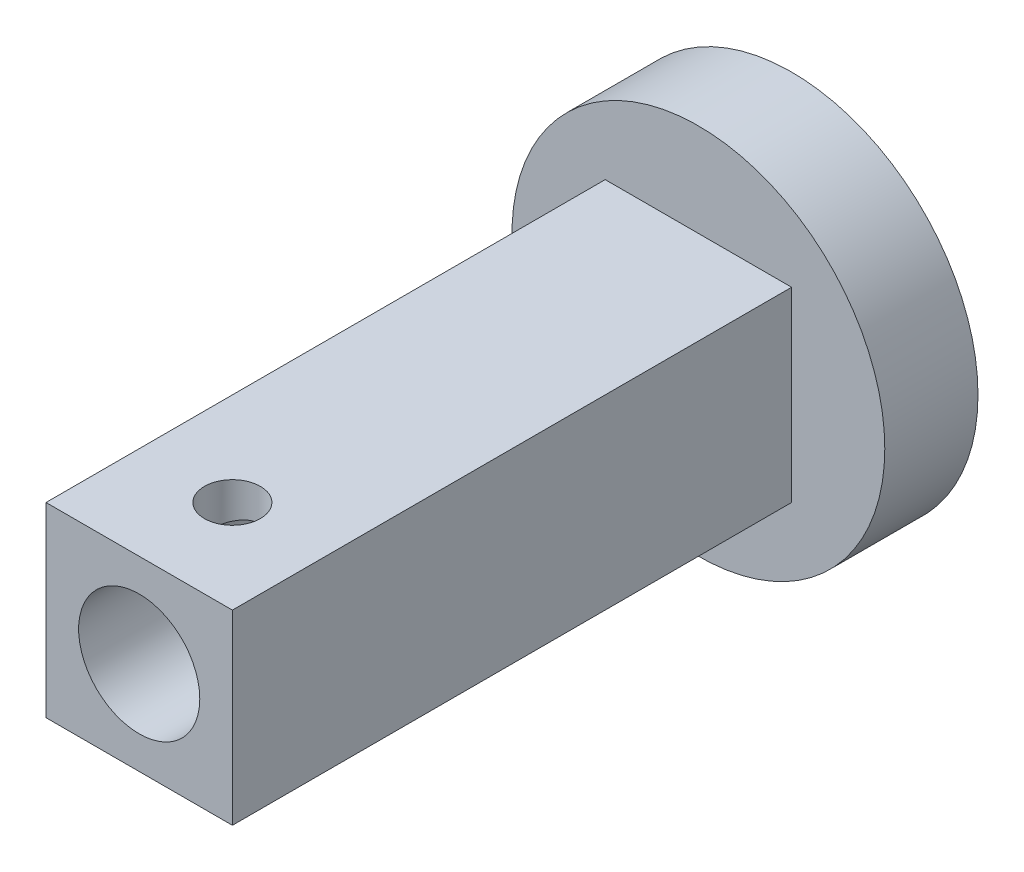
ISO-10303-21;
HEADER;
FILE_DESCRIPTION(('STEP AP214'),'2;1');
FILE_NAME('part.step','',(''),(''),'','','');
FILE_SCHEMA(('AUTOMOTIVE_DESIGN { 1 0 10303 214 1 1 1 1 }'));
ENDSEC;
DATA;
#1=APPLICATION_CONTEXT('core data for automotive mechanical design processes');
#2=APPLICATION_PROTOCOL_DEFINITION('international standard','automotive_design',2000,#1);
#3=PRODUCT_CONTEXT('',#1,'mechanical');
#4=PRODUCT('Part','Part','',(#3));
#5=PRODUCT_RELATED_PRODUCT_CATEGORY('part','',(#4));
#6=PRODUCT_DEFINITION_FORMATION('','',#4);
#7=PRODUCT_DEFINITION_CONTEXT('part definition',#1,'design');
#8=PRODUCT_DEFINITION('design','',#6,#7);
#9=PRODUCT_DEFINITION_SHAPE('','',#8);
#10=(LENGTH_UNIT() NAMED_UNIT(*) SI_UNIT(.MILLI.,.METRE.));
#11=(NAMED_UNIT(*) PLANE_ANGLE_UNIT() SI_UNIT($,.RADIAN.));
#12=(NAMED_UNIT(*) SI_UNIT($,.STERADIAN.) SOLID_ANGLE_UNIT());
#13=UNCERTAINTY_MEASURE_WITH_UNIT(LENGTH_MEASURE(1.E-05),#10,'distance_accuracy_value','');
#14=(GEOMETRIC_REPRESENTATION_CONTEXT(3) GLOBAL_UNCERTAINTY_ASSIGNED_CONTEXT((#13)) GLOBAL_UNIT_ASSIGNED_CONTEXT((#10,
#11,#12)) REPRESENTATION_CONTEXT('',''));
#15=CARTESIAN_POINT('',(0.,0.,0.));
#16=DIRECTION('',(0.,0.,1.));
#17=DIRECTION('',(1.,0.,0.));
#18=AXIS2_PLACEMENT_3D('',#15,#16,#17);
#19=CARTESIAN_POINT('',(0.,0.,5.));
#20=DIRECTION('',(0.,0.,1.));
#21=DIRECTION('',(1.,0.,0.));
#22=AXIS2_PLACEMENT_3D('',#19,#20,#21);
#23=PLANE('',#22);
#24=CARTESIAN_POINT('',(0.,0.,5.));
#25=DIRECTION('',(0.,0.,1.));
#26=DIRECTION('',(1.,0.,0.));
#27=AXIS2_PLACEMENT_3D('',#24,#25,#26);
#28=CIRCLE('',#27,10.);
#29=CARTESIAN_POINT('',(10.,0.,5.));
#30=VERTEX_POINT('',#29);
#31=EDGE_CURVE('E11',#30,#30,#28,.T.);
#32=ORIENTED_EDGE('',*,*,#31,.T.);
#33=EDGE_LOOP('',(#32));
#34=FACE_BOUND('',#33,.T.);
#35=DIRECTION('',(-1.,0.,0.));
#36=VECTOR('',#35,1.);
#37=CARTESIAN_POINT('',(-5.,5.,5.));
#38=LINE('',#37,#36);
#39=CARTESIAN_POINT('',(5.,5.,5.));
#40=VERTEX_POINT('',#39);
#41=CARTESIAN_POINT('',(-5.,5.,5.));
#42=VERTEX_POINT('',#41);
#43=EDGE_CURVE('E92',#40,#42,#38,.T.);
#44=ORIENTED_EDGE('',*,*,#43,.F.);
#45=DIRECTION('',(0.,1.,0.));
#46=VECTOR('',#45,1.);
#47=CARTESIAN_POINT('',(5.,-5.,5.));
#48=LINE('',#47,#46);
#49=CARTESIAN_POINT('',(5.,-5.,5.));
#50=VERTEX_POINT('',#49);
#51=EDGE_CURVE('E103',#50,#40,#48,.T.);
#52=ORIENTED_EDGE('',*,*,#51,.F.);
#53=DIRECTION('',(1.,0.,0.));
#54=VECTOR('',#53,1.);
#55=CARTESIAN_POINT('',(-5.,-5.,5.));
#56=LINE('',#55,#54);
#57=CARTESIAN_POINT('',(-5.,-5.,5.));
#58=VERTEX_POINT('',#57);
#59=EDGE_CURVE('E73',#58,#50,#56,.T.);
#60=ORIENTED_EDGE('',*,*,#59,.F.);
#61=DIRECTION('',(0.,-1.,0.));
#62=VECTOR('',#61,1.);
#63=CARTESIAN_POINT('',(-5.,-5.,5.));
#64=LINE('',#63,#62);
#65=EDGE_CURVE('E108',#42,#58,#64,.T.);
#66=ORIENTED_EDGE('',*,*,#65,.F.);
#67=EDGE_LOOP('',(#44,#52,#60,#66));
#68=FACE_BOUND('',#67,.T.);
#69=ADVANCED_FACE('F36',(#34,#68),#23,.T.);
#70=CARTESIAN_POINT('',(0.,0.,0.));
#71=DIRECTION('',(0.,0.,1.));
#72=DIRECTION('',(1.,0.,0.));
#73=AXIS2_PLACEMENT_3D('',#70,#71,#72);
#74=PLANE('',#73);
#75=CARTESIAN_POINT('',(0.,0.,0.));
#76=DIRECTION('',(0.,0.,1.));
#77=DIRECTION('',(1.,0.,0.));
#78=AXIS2_PLACEMENT_3D('',#75,#76,#77);
#79=CIRCLE('',#78,10.);
#80=CARTESIAN_POINT('',(10.,0.,0.));
#81=VERTEX_POINT('',#80);
#82=EDGE_CURVE('E40',#81,#81,#79,.T.);
#83=ORIENTED_EDGE('',*,*,#82,.F.);
#84=EDGE_LOOP('',(#83));
#85=FACE_BOUND('',#84,.T.);
#86=CARTESIAN_POINT('',(0.,0.,0.));
#87=DIRECTION('',(0.,0.,1.));
#88=DIRECTION('',(1.,0.,0.));
#89=AXIS2_PLACEMENT_3D('',#86,#87,#88);
#90=CIRCLE('',#89,3.25);
#91=CARTESIAN_POINT('',(3.25,0.,0.));
#92=VERTEX_POINT('',#91);
#93=EDGE_CURVE('E114',#92,#92,#90,.T.);
#94=ORIENTED_EDGE('',*,*,#93,.T.);
#95=EDGE_LOOP('',(#94));
#96=FACE_BOUND('',#95,.T.);
#97=ADVANCED_FACE('F122',(#85,#96),#74,.F.);
#98=CARTESIAN_POINT('',(0.,0.,5.));
#99=DIRECTION('',(0.,0.,-1.));
#100=DIRECTION('',(-1.,0.,0.));
#101=AXIS2_PLACEMENT_3D('',#98,#99,#100);
#102=CYLINDRICAL_SURFACE('',#101,10.);
#103=ORIENTED_EDGE('',*,*,#31,.F.);
#104=EDGE_LOOP('',(#103));
#105=FACE_BOUND('',#104,.T.);
#106=ORIENTED_EDGE('',*,*,#82,.T.);
#107=EDGE_LOOP('',(#106));
#108=FACE_BOUND('',#107,.T.);
#109=ADVANCED_FACE('F38',(#105,#108),#102,.T.);
#110=CARTESIAN_POINT('',(0.,0.,5.));
#111=DIRECTION('',(0.,0.,-1.));
#112=DIRECTION('',(-1.,0.,0.));
#113=AXIS2_PLACEMENT_3D('',#110,#111,#112);
#114=CYLINDRICAL_SURFACE('',#113,3.25);
#115=CARTESIAN_POINT('',(0.,3.25,31.5));
#116=CARTESIAN_POINT('',(-0.0795665336020406,3.24999648247277,31.4999957875209));
#117=CARTESIAN_POINT('',(-0.159248802751998,3.24704578523041,31.4936318652863));
#118=CARTESIAN_POINT('',(-0.316302676462147,3.23553478985971,31.4684368188157));
#119=CARTESIAN_POINT('',(-0.393668644355887,3.22696181322454,31.4495775159126));
#120=CARTESIAN_POINT('',(-0.543571236651892,3.2051126172015,31.4002613390825));
#121=CARTESIAN_POINT('',(-0.616124459577145,3.19185368124057,31.369847053397));
#122=CARTESIAN_POINT('',(-0.755011505863265,3.16188428643623,31.2984831664503));
#123=CARTESIAN_POINT('',(-0.821346455351666,3.14517445431165,31.2575354778342));
#124=CARTESIAN_POINT('',(-0.949934488652825,3.10883035500973,31.1637412957995));
#125=CARTESIAN_POINT('',(-1.01177584846844,3.08908710707928,31.1103730891206));
#126=CARTESIAN_POINT('',(-1.12599874800721,3.04931006025544,30.9943643723519));
#127=CARTESIAN_POINT('',(-1.17837420047775,3.02927608328388,30.9317179424784));
#128=CARTESIAN_POINT('',(-1.27548887178323,2.98974101022941,30.7941390566843));
#129=CARTESIAN_POINT('',(-1.31953284801043,2.97035435123641,30.7186793017864));
#130=CARTESIAN_POINT('',(-1.39412192936299,2.93608939546151,30.5604132530109));
#131=CARTESIAN_POINT('',(-1.42467548371612,2.92120827864052,30.4776115966009));
#132=CARTESIAN_POINT('',(-1.46962454078475,2.89884571395906,30.3117245268469));
#133=CARTESIAN_POINT('',(-1.4848179245708,2.8910015734653,30.2289063804143));
#134=CARTESIAN_POINT('',(-1.50108773838038,2.88259066686592,30.0615542706928));
#135=CARTESIAN_POINT('',(-1.50217478633585,2.88201842715938,29.9770216459131));
#136=CARTESIAN_POINT('',(-1.49079280088205,2.88791642352155,29.8175256844061));
#137=CARTESIAN_POINT('',(-1.47964335102251,2.89370119933259,29.7424372111908));
#138=CARTESIAN_POINT('',(-1.44635609280636,2.91048067828192,29.5953488838788));
#139=CARTESIAN_POINT('',(-1.42421554815286,2.92147667875396,29.5233498037562));
#140=CARTESIAN_POINT('',(-1.36913890476633,2.94769456359194,29.3824957158733));
#141=CARTESIAN_POINT('',(-1.33596673085205,2.96300763226557,29.3137507726206));
#142=CARTESIAN_POINT('',(-1.2599408085694,2.99612519429948,29.1824992310562));
#143=CARTESIAN_POINT('',(-1.21708286028503,3.01393076717331,29.1199953559801));
#144=CARTESIAN_POINT('',(-1.11759089744586,3.05231404472979,28.9960295930866));
#145=CARTESIAN_POINT('',(-1.05997849303937,3.07298560052006,28.9353794713411));
#146=CARTESIAN_POINT('',(-0.935250632841351,3.11321361515149,28.8242944951355));
#147=CARTESIAN_POINT('',(-0.868131859637575,3.13276968136724,28.7738632217161));
#148=CARTESIAN_POINT('',(-0.723348423753623,3.16938837780687,28.6830680936934));
#149=CARTESIAN_POINT('',(-0.645401966429364,3.18634309674009,28.6431066922417));
#150=CARTESIAN_POINT('',(-0.482909298354604,3.21497815103089,28.5771606394507));
#151=CARTESIAN_POINT('',(-0.398367620109636,3.22666207188811,28.5511664844807));
#152=CARTESIAN_POINT('',(-0.231801419726403,3.2427218040747,28.5157584231729));
#153=CARTESIAN_POINT('',(-0.150053680320638,3.24757449131577,28.5052597924311));
#154=CARTESIAN_POINT('',(0.0141754579229649,3.25100513162603,28.497818935066));
#155=CARTESIAN_POINT('',(0.0966565689646149,3.2495854463303,28.5008716061922));
#156=CARTESIAN_POINT('',(0.254447728851398,3.24092695083229,28.5197405086181));
#157=CARTESIAN_POINT('',(0.329879815922769,3.23406471548409,28.534731016318));
#158=CARTESIAN_POINT('',(0.477039681748181,3.21565473000496,28.5758259707681));
#159=CARTESIAN_POINT('',(0.548767021851262,3.20410642645937,28.6019317302237));
#160=CARTESIAN_POINT('',(0.689005049925914,3.17695345815228,28.6653176562795));
#161=CARTESIAN_POINT('',(0.757348407882685,3.1612347190555,28.7029174973217));
#162=CARTESIAN_POINT('',(0.886999363186379,3.12733589867659,28.7878753743237));
#163=CARTESIAN_POINT('',(0.948303850462286,3.10915473706587,28.8352376981244));
#164=CARTESIAN_POINT('',(1.0677160558966,3.07030240901949,28.9431170185809));
#165=CARTESIAN_POINT('',(1.12509321772053,3.04955167366765,29.0044158349319));
#166=CARTESIAN_POINT('',(1.22901796417977,3.00917431114152,29.1359711553179));
#167=CARTESIAN_POINT('',(1.27556070251232,2.98954818996151,29.206231646296));
#168=CARTESIAN_POINT('',(1.35774539209928,2.95315331683977,29.3565122225598));
#169=CARTESIAN_POINT('',(1.39301513194685,2.93648892202038,29.4367631918531));
#170=CARTESIAN_POINT('',(1.44918714325353,2.90918351058036,29.6030877230937));
#171=CARTESIAN_POINT('',(1.47010488786372,2.89853600922792,29.6891549041169));
#172=CARTESIAN_POINT('',(1.49529060984287,2.88561745322169,29.8564321692355));
#173=CARTESIAN_POINT('',(1.50087454782971,2.8826853235251,29.9373929418536));
#174=CARTESIAN_POINT('',(1.49890349615771,2.88371144444688,30.0990993783273));
#175=CARTESIAN_POINT('',(1.49135196602765,2.88766788080262,30.179845093214));
#176=CARTESIAN_POINT('',(1.4645026372222,2.90136714358001,30.3329450912279));
#177=CARTESIAN_POINT('',(1.44606164108053,2.91068674382725,30.4054916725593));
#178=CARTESIAN_POINT('',(1.39890570133608,2.93364049026732,30.5464331262932));
#179=CARTESIAN_POINT('',(1.37018772156748,2.94727591136076,30.6148267647851));
#180=CARTESIAN_POINT('',(1.30114142777073,2.97843128061352,30.7504660004962));
#181=CARTESIAN_POINT('',(1.26017322224185,2.99614786625048,30.8173395867084));
#182=CARTESIAN_POINT('',(1.16858143831046,3.0330436879651,30.9436688753762));
#183=CARTESIAN_POINT('',(1.11795345395621,3.05222358907507,31.0031211723353));
#184=CARTESIAN_POINT('',(1.00267081983323,3.09212207628571,31.1189084266443));
#185=CARTESIAN_POINT('',(0.937130722089635,3.1128088140642,31.1743773440259));
#186=CARTESIAN_POINT('',(0.796983612052285,3.15160236946607,31.2736519598549));
#187=CARTESIAN_POINT('',(0.722372364022923,3.16970797320059,31.3174521789542));
#188=CARTESIAN_POINT('',(0.566452903867861,3.2012362062055,31.3915937351064));
#189=CARTESIAN_POINT('',(0.4851942288538,3.21469015731665,31.4220254800126));
#190=CARTESIAN_POINT('',(0.318047129151277,3.23548841356123,31.468442221957));
#191=CARTESIAN_POINT('',(0.232173392454849,3.24285100595264,31.4844704732234));
#192=CARTESIAN_POINT('',(0.121381352624894,3.24782399252521,31.4952796609948));
#193=CARTESIAN_POINT('',(0.0971493876498625,3.24863841958619,31.4970479318607));
#194=CARTESIAN_POINT('',(0.0486152181100407,3.24972696562435,31.4994087555787));
#195=CARTESIAN_POINT('',(0.0243130122848317,3.2500010748449,31.5000012872002));
#196=CARTESIAN_POINT('',(0.,3.25,31.5));
#197=B_SPLINE_CURVE_WITH_KNOTS('',3,(#115,#116,#117,#118,#119,#120,#121,#122,#123,#124,#125,
#126,#127,#128,#129,#130,#131,#132,#133,#134,#135,#136,#137,#138,#139,#140,#141,#142,#143,#144,
#145,#146,#147,#148,#149,#150,#151,#152,#153,#154,#155,#156,#157,#158,#159,#160,#161,#162,#163,
#164,#165,#166,#167,#168,#169,#170,#171,#172,#173,#174,#175,#176,#177,#178,#179,#180,#181,#182,
#183,#184,#185,#186,#187,#188,#189,#190,#191,#192,#193,#194,#195,#196),.UNSPECIFIED.,.T.,.F.,(4,
2,2,2,2,2,2,2,2,2,2,2,2,2,2,2,2,2,2,2,2,2,2,2,2,2,2,2,2,2,2,2,2,2,2,2,2,2,2,2,4),(0.,
0.238600102483912,0.477740118245302,0.716007153654801,0.954230955270992,1.20527368348811,
1.45647728005177,1.72361737244145,1.99058991333629,2.24284530975915,2.49491082085964,
2.72224505371487,2.94963591115234,3.18224489338959,3.41495493301191,3.67231630672517,
3.92976771345169,4.19600797435802,4.46206684922304,4.70843465098172,4.95470969975967,
5.18529144757862,5.41590043453885,5.65361863134684,5.8914414611822,6.14975555625563,
6.4081849756982,6.67442949381559,6.94038651584683,7.18267705005867,7.42490378112662,
7.650220784695,7.87560440949579,8.11582604918682,8.3561575201829,8.61987112719259,
8.88370835055027,9.14573275427444,9.40696763362011,9.47987495044762,9.5527835837666),.UNSPECIFIED.);
#198=CARTESIAN_POINT('',(0.,3.25,31.5));
#199=VERTEX_POINT('',#198);
#200=EDGE_CURVE('E140',#199,#199,#197,.T.);
#201=ORIENTED_EDGE('',*,*,#200,.F.);
#202=EDGE_LOOP('',(#201));
#203=FACE_BOUND('',#202,.T.);
#204=ORIENTED_EDGE('',*,*,#93,.F.);
#205=EDGE_LOOP('',(#204));
#206=FACE_BOUND('',#205,.T.);
#207=CARTESIAN_POINT('',(0.,0.,35.));
#208=DIRECTION('',(0.,0.,1.));
#209=DIRECTION('',(1.,0.,0.));
#210=AXIS2_PLACEMENT_3D('',#207,#208,#209);
#211=CIRCLE('',#210,3.25);
#212=CARTESIAN_POINT('',(3.25,0.,35.));
#213=VERTEX_POINT('',#212);
#214=EDGE_CURVE('E106',#213,#213,#211,.T.);
#215=ORIENTED_EDGE('',*,*,#214,.T.);
#216=EDGE_LOOP('',(#215));
#217=FACE_BOUND('',#216,.T.);
#218=ADVANCED_FACE('F128',(#203,#206,#217),#114,.F.);
#219=CARTESIAN_POINT('',(5.,-5.,35.));
#220=DIRECTION('',(-1.,0.,0.));
#221=DIRECTION('',(0.,0.,1.));
#222=AXIS2_PLACEMENT_3D('',#219,#220,#221);
#223=PLANE('',#222);
#224=ORIENTED_EDGE('',*,*,#51,.T.);
#225=DIRECTION('',(0.,0.,-1.));
#226=VECTOR('',#225,1.);
#227=CARTESIAN_POINT('',(5.,5.,35.));
#228=LINE('',#227,#226);
#229=CARTESIAN_POINT('',(5.,5.,35.));
#230=VERTEX_POINT('',#229);
#231=EDGE_CURVE('E95',#230,#40,#228,.T.);
#232=ORIENTED_EDGE('',*,*,#231,.F.);
#233=DIRECTION('',(0.,1.,0.));
#234=VECTOR('',#233,1.);
#235=CARTESIAN_POINT('',(5.,-5.,35.));
#236=LINE('',#235,#234);
#237=CARTESIAN_POINT('',(5.,-5.,35.));
#238=VERTEX_POINT('',#237);
#239=EDGE_CURVE('E85',#238,#230,#236,.T.);
#240=ORIENTED_EDGE('',*,*,#239,.F.);
#241=DIRECTION('',(0.,0.,-1.));
#242=VECTOR('',#241,1.);
#243=CARTESIAN_POINT('',(5.,-5.,35.));
#244=LINE('',#243,#242);
#245=EDGE_CURVE('E99',#238,#50,#244,.T.);
#246=ORIENTED_EDGE('',*,*,#245,.T.);
#247=EDGE_LOOP('',(#224,#232,#240,#246));
#248=FACE_BOUND('',#247,.T.);
#249=ADVANCED_FACE('F136',(#248),#223,.F.);
#250=CARTESIAN_POINT('',(-5.,5.,35.));
#251=DIRECTION('',(0.,-1.,0.));
#252=DIRECTION('',(0.,0.,-1.));
#253=AXIS2_PLACEMENT_3D('',#250,#251,#252);
#254=PLANE('',#253);
#255=CARTESIAN_POINT('',(0.,5.,30.));
#256=DIRECTION('',(0.,1.,0.));
#257=DIRECTION('',(0.,0.,1.));
#258=AXIS2_PLACEMENT_3D('',#255,#256,#257);
#259=CIRCLE('',#258,1.5);
#260=CARTESIAN_POINT('',(0.,5.,31.5));
#261=VERTEX_POINT('',#260);
#262=EDGE_CURVE('E148',#261,#261,#259,.T.);
#263=ORIENTED_EDGE('',*,*,#262,.F.);
#264=EDGE_LOOP('',(#263));
#265=FACE_BOUND('',#264,.T.);
#266=ORIENTED_EDGE('',*,*,#43,.T.);
#267=DIRECTION('',(0.,0.,-1.));
#268=VECTOR('',#267,1.);
#269=CARTESIAN_POINT('',(-5.,5.,35.));
#270=LINE('',#269,#268);
#271=CARTESIAN_POINT('',(-5.,5.,35.));
#272=VERTEX_POINT('',#271);
#273=EDGE_CURVE('E89',#272,#42,#270,.T.);
#274=ORIENTED_EDGE('',*,*,#273,.F.);
#275=DIRECTION('',(-1.,0.,0.));
#276=VECTOR('',#275,1.);
#277=CARTESIAN_POINT('',(-5.,5.,35.));
#278=LINE('',#277,#276);
#279=EDGE_CURVE('E80',#230,#272,#278,.T.);
#280=ORIENTED_EDGE('',*,*,#279,.F.);
#281=ORIENTED_EDGE('',*,*,#231,.T.);
#282=EDGE_LOOP('',(#266,#274,#280,#281));
#283=FACE_BOUND('',#282,.T.);
#284=ADVANCED_FACE('F90',(#265,#283),#254,.F.);
#285=CARTESIAN_POINT('',(-5.,-5.,35.));
#286=DIRECTION('',(1.,0.,0.));
#287=DIRECTION('',(0.,0.,-1.));
#288=AXIS2_PLACEMENT_3D('',#285,#286,#287);
#289=PLANE('',#288);
#290=ORIENTED_EDGE('',*,*,#65,.T.);
#291=DIRECTION('',(0.,0.,-1.));
#292=VECTOR('',#291,1.);
#293=CARTESIAN_POINT('',(-5.,-5.,35.));
#294=LINE('',#293,#292);
#295=CARTESIAN_POINT('',(-5.,-5.,35.));
#296=VERTEX_POINT('',#295);
#297=EDGE_CURVE('E51',#296,#58,#294,.T.);
#298=ORIENTED_EDGE('',*,*,#297,.F.);
#299=DIRECTION('',(0.,-1.,0.));
#300=VECTOR('',#299,1.);
#301=CARTESIAN_POINT('',(-5.,-5.,35.));
#302=LINE('',#301,#300);
#303=EDGE_CURVE('E83',#272,#296,#302,.T.);
#304=ORIENTED_EDGE('',*,*,#303,.F.);
#305=ORIENTED_EDGE('',*,*,#273,.T.);
#306=EDGE_LOOP('',(#290,#298,#304,#305));
#307=FACE_BOUND('',#306,.T.);
#308=ADVANCED_FACE('F97',(#307),#289,.F.);
#309=CARTESIAN_POINT('',(-5.,-5.,35.));
#310=DIRECTION('',(0.,1.,0.));
#311=DIRECTION('',(0.,0.,1.));
#312=AXIS2_PLACEMENT_3D('',#309,#310,#311);
#313=PLANE('',#312);
#314=ORIENTED_EDGE('',*,*,#59,.T.);
#315=ORIENTED_EDGE('',*,*,#245,.F.);
#316=DIRECTION('',(1.,0.,0.));
#317=VECTOR('',#316,1.);
#318=CARTESIAN_POINT('',(-5.,-5.,35.));
#319=LINE('',#318,#317);
#320=EDGE_CURVE('E59',#296,#238,#319,.T.);
#321=ORIENTED_EDGE('',*,*,#320,.F.);
#322=ORIENTED_EDGE('',*,*,#297,.T.);
#323=EDGE_LOOP('',(#314,#315,#321,#322));
#324=FACE_BOUND('',#323,.T.);
#325=ADVANCED_FACE('F156',(#324),#313,.F.);
#326=CARTESIAN_POINT('',(0.,0.,35.));
#327=DIRECTION('',(0.,0.,-1.));
#328=DIRECTION('',(-1.,0.,0.));
#329=AXIS2_PLACEMENT_3D('',#326,#327,#328);
#330=PLANE('',#329);
#331=ORIENTED_EDGE('',*,*,#214,.F.);
#332=EDGE_LOOP('',(#331));
#333=FACE_BOUND('',#332,.T.);
#334=ORIENTED_EDGE('',*,*,#239,.T.);
#335=ORIENTED_EDGE('',*,*,#279,.T.);
#336=ORIENTED_EDGE('',*,*,#303,.T.);
#337=ORIENTED_EDGE('',*,*,#320,.T.);
#338=EDGE_LOOP('',(#334,#335,#336,#337));
#339=FACE_BOUND('',#338,.T.);
#340=ADVANCED_FACE('F81',(#333,#339),#330,.F.);
#341=CARTESIAN_POINT('',(0.,0.,30.));
#342=DIRECTION('',(0.,1.,0.));
#343=DIRECTION('',(0.,0.,1.));
#344=AXIS2_PLACEMENT_3D('',#341,#342,#343);
#345=CYLINDRICAL_SURFACE('',#344,1.5);
#346=ORIENTED_EDGE('',*,*,#200,.T.);
#347=EDGE_LOOP('',(#346));
#348=FACE_BOUND('',#347,.T.);
#349=ORIENTED_EDGE('',*,*,#262,.T.);
#350=EDGE_LOOP('',(#349));
#351=FACE_BOUND('',#350,.T.);
#352=ADVANCED_FACE('F149',(#348,#351),#345,.F.);
#353=CLOSED_SHELL('',(#69,#97,#109,#218,#249,#284,#308,#325,#340,#352));
#354=MANIFOLD_SOLID_BREP('B2',#353);
#355=ADVANCED_BREP_SHAPE_REPRESENTATION('',(#18,#354),#14);
#356=SHAPE_DEFINITION_REPRESENTATION(#9,#355);
ENDSEC;
END-ISO-10303-21;
